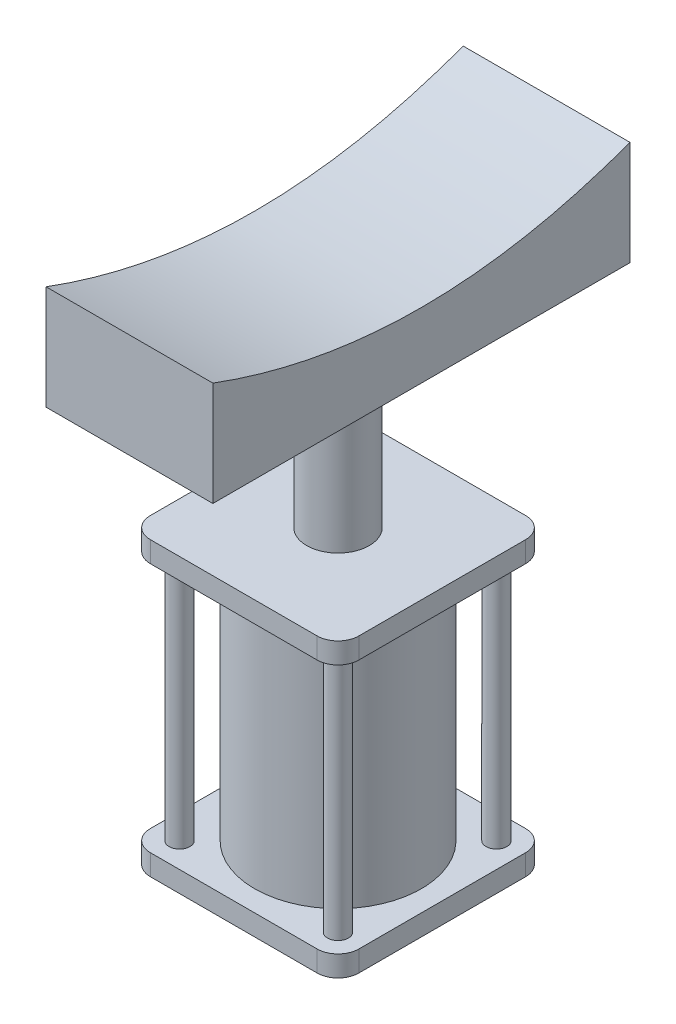
ISO-10303-21;
HEADER;
FILE_DESCRIPTION(('STEP AP214'),'2;1');
FILE_NAME('part.step','',(''),(''),'','','');
FILE_SCHEMA(('AUTOMOTIVE_DESIGN { 1 0 10303 214 1 1 1 1 }'));
ENDSEC;
DATA;
#1=APPLICATION_CONTEXT('core data for automotive mechanical design processes');
#2=APPLICATION_PROTOCOL_DEFINITION('international standard','automotive_design',2000,#1);
#3=PRODUCT_CONTEXT('',#1,'mechanical');
#4=PRODUCT('Part','Part','',(#3));
#5=PRODUCT_RELATED_PRODUCT_CATEGORY('part','',(#4));
#6=PRODUCT_DEFINITION_FORMATION('','',#4);
#7=PRODUCT_DEFINITION_CONTEXT('part definition',#1,'design');
#8=PRODUCT_DEFINITION('design','',#6,#7);
#9=PRODUCT_DEFINITION_SHAPE('','',#8);
#10=(LENGTH_UNIT() NAMED_UNIT(*) SI_UNIT(.MILLI.,.METRE.));
#11=(NAMED_UNIT(*) PLANE_ANGLE_UNIT() SI_UNIT($,.RADIAN.));
#12=(NAMED_UNIT(*) SI_UNIT($,.STERADIAN.) SOLID_ANGLE_UNIT());
#13=UNCERTAINTY_MEASURE_WITH_UNIT(LENGTH_MEASURE(1.E-05),#10,'distance_accuracy_value','');
#14=(GEOMETRIC_REPRESENTATION_CONTEXT(3) GLOBAL_UNCERTAINTY_ASSIGNED_CONTEXT((#13)) GLOBAL_UNIT_ASSIGNED_CONTEXT((#10,
#11,#12)) REPRESENTATION_CONTEXT('',''));
#15=CARTESIAN_POINT('',(0.,0.,0.));
#16=DIRECTION('',(0.,0.,1.));
#17=DIRECTION('',(1.,0.,0.));
#18=AXIS2_PLACEMENT_3D('',#15,#16,#17);
#19=CARTESIAN_POINT('',(-40.,270.,100.));
#20=DIRECTION('',(-1.,0.,0.));
#21=DIRECTION('',(0.,0.,1.));
#22=AXIS2_PLACEMENT_3D('',#19,#20,#21);
#23=PLANE('',#22);
#24=CARTESIAN_POINT('',(-40.,270.,100.));
#25=CARTESIAN_POINT('',(-40.,232.788897751168,0.));
#26=CARTESIAN_POINT('',(-40.,270.,-100.));
#27=B_SPLINE_CURVE_WITH_KNOTS('',2,(#24,#25,#26),.UNSPECIFIED.,.F.,.F.,(3,3),(0.,1.),.UNSPECIFIED.);
#28=CARTESIAN_POINT('',(-40.,270.,-100.));
#29=VERTEX_POINT('',#28);
#30=CARTESIAN_POINT('',(-40.,270.,100.));
#31=VERTEX_POINT('',#30);
#32=EDGE_CURVE('E118',#29,#31,#27,.F.);
#33=ORIENTED_EDGE('',*,*,#32,.F.);
#34=DIRECTION('',(0.,-1.,0.));
#35=VECTOR('',#34,1.);
#36=CARTESIAN_POINT('',(-40.,270.,-100.));
#37=LINE('',#36,#35);
#38=CARTESIAN_POINT('',(-40.,220.,-100.));
#39=VERTEX_POINT('',#38);
#40=EDGE_CURVE('E104',#29,#39,#37,.T.);
#41=ORIENTED_EDGE('',*,*,#40,.T.);
#42=DIRECTION('',(0.,0.,-1.));
#43=VECTOR('',#42,1.);
#44=CARTESIAN_POINT('',(-40.,220.,100.));
#45=LINE('',#44,#43);
#46=CARTESIAN_POINT('',(-40.,220.,100.));
#47=VERTEX_POINT('',#46);
#48=EDGE_CURVE('E99',#47,#39,#45,.T.);
#49=ORIENTED_EDGE('',*,*,#48,.F.);
#50=DIRECTION('',(0.,-1.,0.));
#51=VECTOR('',#50,1.);
#52=CARTESIAN_POINT('',(-40.,270.,100.));
#53=LINE('',#52,#51);
#54=EDGE_CURVE('E12',#31,#47,#53,.T.);
#55=ORIENTED_EDGE('',*,*,#54,.F.);
#56=EDGE_LOOP('',(#33,#41,#49,#55));
#57=FACE_BOUND('',#56,.T.);
#58=ADVANCED_FACE('F43',(#57),#23,.T.);
#59=CARTESIAN_POINT('',(-40.,270.,100.));
#60=DIRECTION('',(0.,0.,-1.));
#61=DIRECTION('',(-1.,0.,0.));
#62=AXIS2_PLACEMENT_3D('',#59,#60,#61);
#63=PLANE('',#62);
#64=DIRECTION('',(1.,0.,0.));
#65=VECTOR('',#64,1.);
#66=CARTESIAN_POINT('',(-40.,220.,100.));
#67=LINE('',#66,#65);
#68=CARTESIAN_POINT('',(40.,220.,100.));
#69=VERTEX_POINT('',#68);
#70=EDGE_CURVE('E76',#47,#69,#67,.T.);
#71=ORIENTED_EDGE('',*,*,#70,.T.);
#72=DIRECTION('',(0.,-1.,0.));
#73=VECTOR('',#72,1.);
#74=CARTESIAN_POINT('',(40.,270.,100.));
#75=LINE('',#74,#73);
#76=CARTESIAN_POINT('',(40.,270.,100.));
#77=VERTEX_POINT('',#76);
#78=EDGE_CURVE('E52',#77,#69,#75,.T.);
#79=ORIENTED_EDGE('',*,*,#78,.F.);
#80=DIRECTION('',(1.,0.,0.));
#81=VECTOR('',#80,1.);
#82=CARTESIAN_POINT('',(-40.,270.,100.));
#83=LINE('',#82,#81);
#84=EDGE_CURVE('E107',#31,#77,#83,.T.);
#85=ORIENTED_EDGE('',*,*,#84,.F.);
#86=ORIENTED_EDGE('',*,*,#54,.T.);
#87=EDGE_LOOP('',(#71,#79,#85,#86));
#88=FACE_BOUND('',#87,.T.);
#89=ADVANCED_FACE('F78',(#88),#63,.F.);
#90=CARTESIAN_POINT('',(40.,270.,100.));
#91=DIRECTION('',(-1.,0.,0.));
#92=DIRECTION('',(0.,0.,1.));
#93=AXIS2_PLACEMENT_3D('',#90,#91,#92);
#94=PLANE('',#93);
#95=DIRECTION('',(0.,-1.,0.));
#96=VECTOR('',#95,1.);
#97=CARTESIAN_POINT('',(40.,270.,-100.));
#98=LINE('',#97,#96);
#99=CARTESIAN_POINT('',(40.,270.,-100.));
#100=VERTEX_POINT('',#99);
#101=CARTESIAN_POINT('',(40.,220.,-100.));
#102=VERTEX_POINT('',#101);
#103=EDGE_CURVE('E93',#100,#102,#98,.T.);
#104=ORIENTED_EDGE('',*,*,#103,.F.);
#105=CARTESIAN_POINT('',(40.,270.,100.));
#106=CARTESIAN_POINT('',(40.,232.788897751168,0.));
#107=CARTESIAN_POINT('',(40.,270.,-100.));
#108=B_SPLINE_CURVE_WITH_KNOTS('',2,(#105,#106,#107),.UNSPECIFIED.,.F.,.F.,(3,3),(0.,1.),.UNSPECIFIED.);
#109=EDGE_CURVE('E60',#77,#100,#108,.T.);
#110=ORIENTED_EDGE('',*,*,#109,.F.);
#111=ORIENTED_EDGE('',*,*,#78,.T.);
#112=DIRECTION('',(0.,0.,-1.));
#113=VECTOR('',#112,1.);
#114=CARTESIAN_POINT('',(40.,220.,100.));
#115=LINE('',#114,#113);
#116=EDGE_CURVE('E87',#69,#102,#115,.T.);
#117=ORIENTED_EDGE('',*,*,#116,.T.);
#118=EDGE_LOOP('',(#104,#110,#111,#117));
#119=FACE_BOUND('',#118,.T.);
#120=ADVANCED_FACE('F91',(#119),#94,.F.);
#121=CARTESIAN_POINT('',(-40.,270.,-100.));
#122=DIRECTION('',(0.,0.,-1.));
#123=DIRECTION('',(-1.,0.,0.));
#124=AXIS2_PLACEMENT_3D('',#121,#122,#123);
#125=PLANE('',#124);
#126=DIRECTION('',(1.,0.,0.));
#127=VECTOR('',#126,1.);
#128=CARTESIAN_POINT('',(-40.,220.,-100.));
#129=LINE('',#128,#127);
#130=EDGE_CURVE('E97',#39,#102,#129,.T.);
#131=ORIENTED_EDGE('',*,*,#130,.F.);
#132=ORIENTED_EDGE('',*,*,#40,.F.);
#133=DIRECTION('',(1.,0.,0.));
#134=VECTOR('',#133,1.);
#135=CARTESIAN_POINT('',(-40.,270.,-100.));
#136=LINE('',#135,#134);
#137=EDGE_CURVE('E86',#29,#100,#136,.T.);
#138=ORIENTED_EDGE('',*,*,#137,.T.);
#139=ORIENTED_EDGE('',*,*,#103,.T.);
#140=EDGE_LOOP('',(#131,#132,#138,#139));
#141=FACE_BOUND('',#140,.T.);
#142=ADVANCED_FACE('F124',(#141),#125,.T.);
#143=CARTESIAN_POINT('',(0.,220.,0.));
#144=DIRECTION('',(0.,-1.,0.));
#145=DIRECTION('',(0.,0.,-1.));
#146=AXIS2_PLACEMENT_3D('',#143,#144,#145);
#147=PLANE('',#146);
#148=ORIENTED_EDGE('',*,*,#48,.T.);
#149=ORIENTED_EDGE('',*,*,#130,.T.);
#150=ORIENTED_EDGE('',*,*,#116,.F.);
#151=ORIENTED_EDGE('',*,*,#70,.F.);
#152=EDGE_LOOP('',(#148,#149,#150,#151));
#153=FACE_BOUND('',#152,.T.);
#154=ADVANCED_FACE('F95',(#153),#147,.T.);
#155=CARTESIAN_POINT('',(-1460.,270.,100.));
#156=CARTESIAN_POINT('',(-1460.,232.788897751168,0.));
#157=CARTESIAN_POINT('',(-1460.,270.,-100.));
#158=B_SPLINE_CURVE_WITH_KNOTS('',2,(#155,#156,#157),.UNSPECIFIED.,.F.,.F.,(3,3),(0.,1.),.UNSPECIFIED.);
#159=DIRECTION('',(1.,0.,0.));
#160=VECTOR('',#159,1.);
#161=SURFACE_OF_LINEAR_EXTRUSION('',#158,#160);
#162=ORIENTED_EDGE('',*,*,#32,.T.);
#163=ORIENTED_EDGE('',*,*,#84,.T.);
#164=ORIENTED_EDGE('',*,*,#109,.T.);
#165=ORIENTED_EDGE('',*,*,#137,.F.);
#166=EDGE_LOOP('',(#162,#163,#164,#165));
#167=FACE_BOUND('',#166,.T.);
#168=ADVANCED_FACE('F115',(#167),#161,.F.);
#169=CLOSED_SHELL('',(#58,#89,#120,#142,#154,#168));
#170=MANIFOLD_SOLID_BREP('B2',#169);
#171=CARTESIAN_POINT('',(0.,220.,0.));
#172=DIRECTION('',(0.,-1.,0.));
#173=DIRECTION('',(0.,0.,-1.));
#174=AXIS2_PLACEMENT_3D('',#171,#172,#173);
#175=CYLINDRICAL_SURFACE('',#174,15.);
#176=CARTESIAN_POINT('',(0.,220.,0.));
#177=DIRECTION('',(0.,1.,0.));
#178=DIRECTION('',(0.,0.,1.));
#179=AXIS2_PLACEMENT_3D('',#176,#177,#178);
#180=CIRCLE('',#179,15.);
#181=CARTESIAN_POINT('',(0.,220.,15.));
#182=VERTEX_POINT('',#181);
#183=EDGE_CURVE('E42',#182,#182,#180,.T.);
#184=ORIENTED_EDGE('',*,*,#183,.F.);
#185=EDGE_LOOP('',(#184));
#186=FACE_BOUND('',#185,.T.);
#187=CARTESIAN_POINT('',(0.,140.,0.));
#188=DIRECTION('',(0.,1.,0.));
#189=DIRECTION('',(0.,0.,1.));
#190=AXIS2_PLACEMENT_3D('',#187,#188,#189);
#191=CIRCLE('',#190,15.);
#192=CARTESIAN_POINT('',(0.,140.,15.));
#193=VERTEX_POINT('',#192);
#194=EDGE_CURVE('E205',#193,#193,#191,.T.);
#195=ORIENTED_EDGE('',*,*,#194,.T.);
#196=EDGE_LOOP('',(#195));
#197=FACE_BOUND('',#196,.T.);
#198=ADVANCED_FACE('F202',(#186,#197),#175,.T.);
#199=CARTESIAN_POINT('',(0.,220.,0.));
#200=DIRECTION('',(0.,1.,0.));
#201=DIRECTION('',(0.,0.,1.));
#202=AXIS2_PLACEMENT_3D('',#199,#200,#201);
#203=PLANE('',#202);
#204=ORIENTED_EDGE('',*,*,#183,.T.);
#205=EDGE_LOOP('',(#204));
#206=FACE_BOUND('',#205,.T.);
#207=ADVANCED_FACE('F217',(#206),#203,.T.);
#208=CARTESIAN_POINT('',(0.,140.,0.));
#209=DIRECTION('',(0.,1.,0.));
#210=DIRECTION('',(0.,0.,1.));
#211=AXIS2_PLACEMENT_3D('',#208,#209,#210);
#212=PLANE('',#211);
#213=ORIENTED_EDGE('',*,*,#194,.F.);
#214=EDGE_LOOP('',(#213));
#215=FACE_BOUND('',#214,.T.);
#216=ADVANCED_FACE('F215',(#215),#212,.F.);
#217=CLOSED_SHELL('',(#198,#207,#216));
#218=MANIFOLD_SOLID_BREP('B6',#217);
#219=CARTESIAN_POINT('',(50.,10.,50.));
#220=DIRECTION('',(-1.,0.,0.));
#221=DIRECTION('',(0.,0.,1.));
#222=AXIS2_PLACEMENT_3D('',#219,#220,#221);
#223=PLANE('',#222);
#224=DIRECTION('',(0.,0.,-1.));
#225=VECTOR('',#224,1.);
#226=CARTESIAN_POINT('',(50.,0.,50.));
#227=LINE('',#226,#225);
#228=CARTESIAN_POINT('',(50.,0.,40.));
#229=VERTEX_POINT('',#228);
#230=CARTESIAN_POINT('',(50.,0.,-40.));
#231=VERTEX_POINT('',#230);
#232=EDGE_CURVE('E383',#229,#231,#227,.T.);
#233=ORIENTED_EDGE('',*,*,#232,.T.);
#234=DIRECTION('',(0.,-1.,0.));
#235=VECTOR('',#234,1.);
#236=CARTESIAN_POINT('',(50.,10.,-40.));
#237=LINE('',#236,#235);
#238=CARTESIAN_POINT('',(50.,10.,-40.));
#239=VERTEX_POINT('',#238);
#240=EDGE_CURVE('E361',#231,#239,#237,.F.);
#241=ORIENTED_EDGE('',*,*,#240,.T.);
#242=DIRECTION('',(0.,0.,-1.));
#243=VECTOR('',#242,1.);
#244=CARTESIAN_POINT('',(50.,10.,50.));
#245=LINE('',#244,#243);
#246=CARTESIAN_POINT('',(50.,10.,40.));
#247=VERTEX_POINT('',#246);
#248=EDGE_CURVE('E394',#247,#239,#245,.T.);
#249=ORIENTED_EDGE('',*,*,#248,.F.);
#250=DIRECTION('',(0.,-1.,0.));
#251=VECTOR('',#250,1.);
#252=CARTESIAN_POINT('',(50.,10.,40.));
#253=LINE('',#252,#251);
#254=EDGE_CURVE('E366',#247,#229,#253,.T.);
#255=ORIENTED_EDGE('',*,*,#254,.T.);
#256=EDGE_LOOP('',(#233,#241,#249,#255));
#257=FACE_BOUND('',#256,.T.);
#258=ADVANCED_FACE('F242',(#257),#223,.F.);
#259=CARTESIAN_POINT('',(-50.,10.,-50.));
#260=DIRECTION('',(0.,0.,1.));
#261=DIRECTION('',(1.,0.,0.));
#262=AXIS2_PLACEMENT_3D('',#259,#260,#261);
#263=PLANE('',#262);
#264=DIRECTION('',(-1.,0.,0.));
#265=VECTOR('',#264,1.);
#266=CARTESIAN_POINT('',(-50.,10.,-50.));
#267=LINE('',#266,#265);
#268=CARTESIAN_POINT('',(40.,10.,-50.));
#269=VERTEX_POINT('',#268);
#270=CARTESIAN_POINT('',(-40.,10.,-50.));
#271=VERTEX_POINT('',#270);
#272=EDGE_CURVE('E376',#269,#271,#267,.T.);
#273=ORIENTED_EDGE('',*,*,#272,.F.);
#274=DIRECTION('',(0.,-1.,0.));
#275=VECTOR('',#274,1.);
#276=CARTESIAN_POINT('',(40.,10.,-50.));
#277=LINE('',#276,#275);
#278=CARTESIAN_POINT('',(40.,0.,-50.));
#279=VERTEX_POINT('',#278);
#280=EDGE_CURVE('E360',#269,#279,#277,.T.);
#281=ORIENTED_EDGE('',*,*,#280,.T.);
#282=DIRECTION('',(-1.,0.,0.));
#283=VECTOR('',#282,1.);
#284=CARTESIAN_POINT('',(-50.,0.,-50.));
#285=LINE('',#284,#283);
#286=CARTESIAN_POINT('',(-40.,0.,-50.));
#287=VERTEX_POINT('',#286);
#288=EDGE_CURVE('E373',#279,#287,#285,.T.);
#289=ORIENTED_EDGE('',*,*,#288,.T.);
#290=DIRECTION('',(0.,-1.,0.));
#291=VECTOR('',#290,1.);
#292=CARTESIAN_POINT('',(-40.,10.,-50.));
#293=LINE('',#292,#291);
#294=EDGE_CURVE('E378',#287,#271,#293,.F.);
#295=ORIENTED_EDGE('',*,*,#294,.T.);
#296=EDGE_LOOP('',(#273,#281,#289,#295));
#297=FACE_BOUND('',#296,.T.);
#298=ADVANCED_FACE('F372',(#297),#263,.F.);
#299=CARTESIAN_POINT('',(-50.,10.,50.));
#300=DIRECTION('',(1.,0.,0.));
#301=DIRECTION('',(0.,0.,-1.));
#302=AXIS2_PLACEMENT_3D('',#299,#300,#301);
#303=PLANE('',#302);
#304=DIRECTION('',(0.,0.,1.));
#305=VECTOR('',#304,1.);
#306=CARTESIAN_POINT('',(-50.,0.,50.));
#307=LINE('',#306,#305);
#308=CARTESIAN_POINT('',(-50.,0.,-40.));
#309=VERTEX_POINT('',#308);
#310=CARTESIAN_POINT('',(-50.,0.,40.));
#311=VERTEX_POINT('',#310);
#312=EDGE_CURVE('E382',#309,#311,#307,.T.);
#313=ORIENTED_EDGE('',*,*,#312,.T.);
#314=DIRECTION('',(0.,-1.,0.));
#315=VECTOR('',#314,1.);
#316=CARTESIAN_POINT('',(-50.,10.,40.));
#317=LINE('',#316,#315);
#318=CARTESIAN_POINT('',(-50.,10.,40.));
#319=VERTEX_POINT('',#318);
#320=EDGE_CURVE('E444',#311,#319,#317,.F.);
#321=ORIENTED_EDGE('',*,*,#320,.T.);
#322=DIRECTION('',(0.,0.,1.));
#323=VECTOR('',#322,1.);
#324=CARTESIAN_POINT('',(-50.,10.,50.));
#325=LINE('',#324,#323);
#326=CARTESIAN_POINT('',(-50.,10.,-40.));
#327=VERTEX_POINT('',#326);
#328=EDGE_CURVE('E511',#327,#319,#325,.T.);
#329=ORIENTED_EDGE('',*,*,#328,.F.);
#330=DIRECTION('',(0.,-1.,0.));
#331=VECTOR('',#330,1.);
#332=CARTESIAN_POINT('',(-50.,10.,-40.));
#333=LINE('',#332,#331);
#334=EDGE_CURVE('E441',#327,#309,#333,.T.);
#335=ORIENTED_EDGE('',*,*,#334,.T.);
#336=EDGE_LOOP('',(#313,#321,#329,#335));
#337=FACE_BOUND('',#336,.T.);
#338=ADVANCED_FACE('F533',(#337),#303,.F.);
#339=CARTESIAN_POINT('',(-50.,10.,50.));
#340=DIRECTION('',(0.,0.,-1.));
#341=DIRECTION('',(-1.,0.,0.));
#342=AXIS2_PLACEMENT_3D('',#339,#340,#341);
#343=PLANE('',#342);
#344=DIRECTION('',(1.,0.,0.));
#345=VECTOR('',#344,1.);
#346=CARTESIAN_POINT('',(-50.,0.,50.));
#347=LINE('',#346,#345);
#348=CARTESIAN_POINT('',(-40.,0.,50.));
#349=VERTEX_POINT('',#348);
#350=CARTESIAN_POINT('',(40.,0.,50.));
#351=VERTEX_POINT('',#350);
#352=EDGE_CURVE('E386',#349,#351,#347,.T.);
#353=ORIENTED_EDGE('',*,*,#352,.T.);
#354=DIRECTION('',(0.,-1.,0.));
#355=VECTOR('',#354,1.);
#356=CARTESIAN_POINT('',(40.,10.,50.));
#357=LINE('',#356,#355);
#358=CARTESIAN_POINT('',(40.,10.,50.));
#359=VERTEX_POINT('',#358);
#360=EDGE_CURVE('E439',#351,#359,#357,.F.);
#361=ORIENTED_EDGE('',*,*,#360,.T.);
#362=DIRECTION('',(1.,0.,0.));
#363=VECTOR('',#362,1.);
#364=CARTESIAN_POINT('',(-50.,10.,50.));
#365=LINE('',#364,#363);
#366=CARTESIAN_POINT('',(-40.,10.,50.));
#367=VERTEX_POINT('',#366);
#368=EDGE_CURVE('E399',#367,#359,#365,.T.);
#369=ORIENTED_EDGE('',*,*,#368,.F.);
#370=DIRECTION('',(0.,-1.,0.));
#371=VECTOR('',#370,1.);
#372=CARTESIAN_POINT('',(-40.,10.,50.));
#373=LINE('',#372,#371);
#374=EDGE_CURVE('E436',#367,#349,#373,.T.);
#375=ORIENTED_EDGE('',*,*,#374,.T.);
#376=EDGE_LOOP('',(#353,#361,#369,#375));
#377=FACE_BOUND('',#376,.T.);
#378=ADVANCED_FACE('F528',(#377),#343,.F.);
#379=CARTESIAN_POINT('',(0.,10.,0.));
#380=DIRECTION('',(0.,-1.,0.));
#381=DIRECTION('',(0.,0.,-1.));
#382=AXIS2_PLACEMENT_3D('',#379,#380,#381);
#383=PLANE('',#382);
#384=CARTESIAN_POINT('',(-38.,10.,38.));
#385=DIRECTION('',(0.,-1.,0.));
#386=DIRECTION('',(0.,0.,-1.));
#387=AXIS2_PLACEMENT_3D('',#384,#385,#386);
#388=CIRCLE('',#387,5.);
#389=CARTESIAN_POINT('',(-38.,10.,33.));
#390=VERTEX_POINT('',#389);
#391=EDGE_CURVE('E417',#390,#390,#388,.F.);
#392=ORIENTED_EDGE('',*,*,#391,.F.);
#393=EDGE_LOOP('',(#392));
#394=FACE_BOUND('',#393,.T.);
#395=CARTESIAN_POINT('',(38.,10.,38.));
#396=DIRECTION('',(0.,-1.,0.));
#397=DIRECTION('',(0.,0.,-1.));
#398=AXIS2_PLACEMENT_3D('',#395,#396,#397);
#399=CIRCLE('',#398,5.);
#400=CARTESIAN_POINT('',(38.,10.,33.));
#401=VERTEX_POINT('',#400);
#402=EDGE_CURVE('E411',#401,#401,#399,.F.);
#403=ORIENTED_EDGE('',*,*,#402,.F.);
#404=EDGE_LOOP('',(#403));
#405=FACE_BOUND('',#404,.T.);
#406=CARTESIAN_POINT('',(38.,10.,-38.));
#407=DIRECTION('',(0.,-1.,0.));
#408=DIRECTION('',(0.,0.,-1.));
#409=AXIS2_PLACEMENT_3D('',#406,#407,#408);
#410=CIRCLE('',#409,5.);
#411=CARTESIAN_POINT('',(38.,10.,-43.));
#412=VERTEX_POINT('',#411);
#413=EDGE_CURVE('E405',#412,#412,#410,.F.);
#414=ORIENTED_EDGE('',*,*,#413,.F.);
#415=EDGE_LOOP('',(#414));
#416=FACE_BOUND('',#415,.T.);
#417=CARTESIAN_POINT('',(0.,9.99999999999999,0.));
#418=DIRECTION('',(0.,-1.,0.));
#419=DIRECTION('',(0.,0.,-1.));
#420=AXIS2_PLACEMENT_3D('',#417,#418,#419);
#421=CIRCLE('',#420,40.);
#422=CARTESIAN_POINT('',(0.,9.99999999999999,-40.));
#423=VERTEX_POINT('',#422);
#424=EDGE_CURVE('E398',#423,#423,#421,.F.);
#425=ORIENTED_EDGE('',*,*,#424,.F.);
#426=EDGE_LOOP('',(#425));
#427=FACE_BOUND('',#426,.T.);
#428=CARTESIAN_POINT('',(-38.,10.,-38.));
#429=DIRECTION('',(0.,-1.,0.));
#430=DIRECTION('',(0.,0.,-1.));
#431=AXIS2_PLACEMENT_3D('',#428,#429,#430);
#432=CIRCLE('',#431,5.);
#433=CARTESIAN_POINT('',(-38.,10.,-43.));
#434=VERTEX_POINT('',#433);
#435=EDGE_CURVE('E395',#434,#434,#432,.F.);
#436=ORIENTED_EDGE('',*,*,#435,.F.);
#437=EDGE_LOOP('',(#436));
#438=FACE_BOUND('',#437,.T.);
#439=ORIENTED_EDGE('',*,*,#248,.T.);
#440=CARTESIAN_POINT('',(40.,10.,-40.));
#441=DIRECTION('',(0.,-1.,0.));
#442=DIRECTION('',(0.,0.,-1.));
#443=AXIS2_PLACEMENT_3D('',#440,#441,#442);
#444=CIRCLE('',#443,10.);
#445=EDGE_CURVE('E434',#239,#269,#444,.F.);
#446=ORIENTED_EDGE('',*,*,#445,.T.);
#447=ORIENTED_EDGE('',*,*,#272,.T.);
#448=CARTESIAN_POINT('',(-40.,10.,-40.));
#449=DIRECTION('',(0.,-1.,0.));
#450=DIRECTION('',(0.,0.,-1.));
#451=AXIS2_PLACEMENT_3D('',#448,#449,#450);
#452=CIRCLE('',#451,10.);
#453=EDGE_CURVE('E428',#271,#327,#452,.F.);
#454=ORIENTED_EDGE('',*,*,#453,.T.);
#455=ORIENTED_EDGE('',*,*,#328,.T.);
#456=CARTESIAN_POINT('',(-40.,10.,40.));
#457=DIRECTION('',(0.,-1.,0.));
#458=DIRECTION('',(0.,0.,-1.));
#459=AXIS2_PLACEMENT_3D('',#456,#457,#458);
#460=CIRCLE('',#459,10.);
#461=EDGE_CURVE('E430',#319,#367,#460,.F.);
#462=ORIENTED_EDGE('',*,*,#461,.T.);
#463=ORIENTED_EDGE('',*,*,#368,.T.);
#464=CARTESIAN_POINT('',(40.,10.,40.));
#465=DIRECTION('',(0.,-1.,0.));
#466=DIRECTION('',(0.,0.,-1.));
#467=AXIS2_PLACEMENT_3D('',#464,#465,#466);
#468=CIRCLE('',#467,10.);
#469=EDGE_CURVE('E432',#359,#247,#468,.F.);
#470=ORIENTED_EDGE('',*,*,#469,.T.);
#471=EDGE_LOOP('',(#439,#446,#447,#454,#455,#462,#463,#470));
#472=FACE_BOUND('',#471,.T.);
#473=ADVANCED_FACE('F517',(#394,#405,#416,#427,#438,#472),#383,.F.);
#474=CARTESIAN_POINT('',(0.,0.,0.));
#475=DIRECTION('',(0.,-1.,0.));
#476=DIRECTION('',(0.,0.,-1.));
#477=AXIS2_PLACEMENT_3D('',#474,#475,#476);
#478=PLANE('',#477);
#479=ORIENTED_EDGE('',*,*,#288,.F.);
#480=CARTESIAN_POINT('',(40.,0.,-40.));
#481=DIRECTION('',(0.,-1.,0.));
#482=DIRECTION('',(0.,0.,-1.));
#483=AXIS2_PLACEMENT_3D('',#480,#481,#482);
#484=CIRCLE('',#483,10.);
#485=EDGE_CURVE('E356',#279,#231,#484,.T.);
#486=ORIENTED_EDGE('',*,*,#485,.T.);
#487=ORIENTED_EDGE('',*,*,#232,.F.);
#488=CARTESIAN_POINT('',(40.,0.,40.));
#489=DIRECTION('',(0.,-1.,0.));
#490=DIRECTION('',(0.,0.,-1.));
#491=AXIS2_PLACEMENT_3D('',#488,#489,#490);
#492=CIRCLE('',#491,10.);
#493=EDGE_CURVE('E367',#229,#351,#492,.T.);
#494=ORIENTED_EDGE('',*,*,#493,.T.);
#495=ORIENTED_EDGE('',*,*,#352,.F.);
#496=CARTESIAN_POINT('',(-40.,0.,40.));
#497=DIRECTION('',(0.,-1.,0.));
#498=DIRECTION('',(0.,0.,-1.));
#499=AXIS2_PLACEMENT_3D('',#496,#497,#498);
#500=CIRCLE('',#499,10.);
#501=EDGE_CURVE('E422',#349,#311,#500,.T.);
#502=ORIENTED_EDGE('',*,*,#501,.T.);
#503=ORIENTED_EDGE('',*,*,#312,.F.);
#504=CARTESIAN_POINT('',(-40.,0.,-40.));
#505=DIRECTION('',(0.,-1.,0.));
#506=DIRECTION('',(0.,0.,-1.));
#507=AXIS2_PLACEMENT_3D('',#504,#505,#506);
#508=CIRCLE('',#507,10.);
#509=EDGE_CURVE('E377',#309,#287,#508,.T.);
#510=ORIENTED_EDGE('',*,*,#509,.T.);
#511=EDGE_LOOP('',(#479,#486,#487,#494,#495,#502,#503,#510));
#512=FACE_BOUND('',#511,.T.);
#513=ADVANCED_FACE('F380',(#512),#478,.T.);
#514=CARTESIAN_POINT('',(-38.,144.142135623731,-38.));
#515=DIRECTION('',(0.,-1.,0.));
#516=DIRECTION('',(0.,0.,-1.));
#517=AXIS2_PLACEMENT_3D('',#514,#515,#516);
#518=CYLINDRICAL_SURFACE('',#517,5.);
#519=ORIENTED_EDGE('',*,*,#435,.T.);
#520=EDGE_LOOP('',(#519));
#521=FACE_BOUND('',#520,.T.);
#522=CARTESIAN_POINT('',(-38.,130.,-38.));
#523=DIRECTION('',(0.,1.,0.));
#524=DIRECTION('',(0.,0.,1.));
#525=AXIS2_PLACEMENT_3D('',#522,#523,#524);
#526=CIRCLE('',#525,5.);
#527=CARTESIAN_POINT('',(-38.,130.,-33.));
#528=VERTEX_POINT('',#527);
#529=EDGE_CURVE('E388',#528,#528,#526,.T.);
#530=ORIENTED_EDGE('',*,*,#529,.F.);
#531=EDGE_LOOP('',(#530));
#532=FACE_BOUND('',#531,.T.);
#533=ADVANCED_FACE('F647',(#521,#532),#518,.T.);
#534=CARTESIAN_POINT('',(0.,130.,0.));
#535=DIRECTION('',(0.,-1.,0.));
#536=DIRECTION('',(0.,0.,-1.));
#537=AXIS2_PLACEMENT_3D('',#534,#535,#536);
#538=CYLINDRICAL_SURFACE('',#537,40.);
#539=CARTESIAN_POINT('',(0.,130.,0.));
#540=DIRECTION('',(0.,1.,0.));
#541=DIRECTION('',(0.,0.,1.));
#542=AXIS2_PLACEMENT_3D('',#539,#540,#541);
#543=CIRCLE('',#542,40.);
#544=CARTESIAN_POINT('',(0.,130.,40.));
#545=VERTEX_POINT('',#544);
#546=EDGE_CURVE('E502',#545,#545,#543,.T.);
#547=ORIENTED_EDGE('',*,*,#546,.F.);
#548=EDGE_LOOP('',(#547));
#549=FACE_BOUND('',#548,.T.);
#550=ORIENTED_EDGE('',*,*,#424,.T.);
#551=EDGE_LOOP('',(#550));
#552=FACE_BOUND('',#551,.T.);
#553=ADVANCED_FACE('F644',(#549,#552),#538,.T.);
#554=CARTESIAN_POINT('',(-50.,140.,-50.));
#555=DIRECTION('',(1.,0.,0.));
#556=DIRECTION('',(0.,0.,-1.));
#557=AXIS2_PLACEMENT_3D('',#554,#555,#556);
#558=PLANE('',#557);
#559=DIRECTION('',(0.,0.,1.));
#560=VECTOR('',#559,1.);
#561=CARTESIAN_POINT('',(-50.,140.,-50.));
#562=LINE('',#561,#560);
#563=CARTESIAN_POINT('',(-50.,140.,-40.));
#564=VERTEX_POINT('',#563);
#565=CARTESIAN_POINT('',(-50.,140.,40.));
#566=VERTEX_POINT('',#565);
#567=EDGE_CURVE('E501',#564,#566,#562,.T.);
#568=ORIENTED_EDGE('',*,*,#567,.F.);
#569=DIRECTION('',(0.,-1.,0.));
#570=VECTOR('',#569,1.);
#571=CARTESIAN_POINT('',(-50.,140.,-40.));
#572=LINE('',#571,#570);
#573=CARTESIAN_POINT('',(-50.,130.,-40.));
#574=VERTEX_POINT('',#573);
#575=EDGE_CURVE('E448',#564,#574,#572,.T.);
#576=ORIENTED_EDGE('',*,*,#575,.T.);
#577=DIRECTION('',(0.,0.,1.));
#578=VECTOR('',#577,1.);
#579=CARTESIAN_POINT('',(-50.,130.,-50.));
#580=LINE('',#579,#578);
#581=CARTESIAN_POINT('',(-50.,130.,40.));
#582=VERTEX_POINT('',#581);
#583=EDGE_CURVE('E492',#574,#582,#580,.T.);
#584=ORIENTED_EDGE('',*,*,#583,.T.);
#585=DIRECTION('',(0.,-1.,0.));
#586=VECTOR('',#585,1.);
#587=CARTESIAN_POINT('',(-50.,140.,40.));
#588=LINE('',#587,#586);
#589=EDGE_CURVE('E446',#582,#566,#588,.F.);
#590=ORIENTED_EDGE('',*,*,#589,.T.);
#591=EDGE_LOOP('',(#568,#576,#584,#590));
#592=FACE_BOUND('',#591,.T.);
#593=ADVANCED_FACE('F627',(#592),#558,.F.);
#594=CARTESIAN_POINT('',(-50.,140.,50.));
#595=DIRECTION('',(0.,0.,-1.));
#596=DIRECTION('',(-1.,0.,0.));
#597=AXIS2_PLACEMENT_3D('',#594,#595,#596);
#598=PLANE('',#597);
#599=DIRECTION('',(1.,0.,0.));
#600=VECTOR('',#599,1.);
#601=CARTESIAN_POINT('',(-50.,130.,50.));
#602=LINE('',#601,#600);
#603=CARTESIAN_POINT('',(-40.,130.,50.));
#604=VERTEX_POINT('',#603);
#605=CARTESIAN_POINT('',(40.,130.,50.));
#606=VERTEX_POINT('',#605);
#607=EDGE_CURVE('E481',#604,#606,#602,.T.);
#608=ORIENTED_EDGE('',*,*,#607,.T.);
#609=DIRECTION('',(0.,-1.,0.));
#610=VECTOR('',#609,1.);
#611=CARTESIAN_POINT('',(40.,140.,50.));
#612=LINE('',#611,#610);
#613=CARTESIAN_POINT('',(40.,140.,50.));
#614=VERTEX_POINT('',#613);
#615=EDGE_CURVE('E200',#606,#614,#612,.F.);
#616=ORIENTED_EDGE('',*,*,#615,.T.);
#617=DIRECTION('',(1.,0.,0.));
#618=VECTOR('',#617,1.);
#619=CARTESIAN_POINT('',(-50.,140.,50.));
#620=LINE('',#619,#618);
#621=CARTESIAN_POINT('',(-40.,140.,50.));
#622=VERTEX_POINT('',#621);
#623=EDGE_CURVE('E483',#622,#614,#620,.T.);
#624=ORIENTED_EDGE('',*,*,#623,.F.);
#625=DIRECTION('',(0.,-1.,0.));
#626=VECTOR('',#625,1.);
#627=CARTESIAN_POINT('',(-40.,140.,50.));
#628=LINE('',#627,#626);
#629=EDGE_CURVE('E250',#622,#604,#628,.T.);
#630=ORIENTED_EDGE('',*,*,#629,.T.);
#631=EDGE_LOOP('',(#608,#616,#624,#630));
#632=FACE_BOUND('',#631,.T.);
#633=ADVANCED_FACE('F480',(#632),#598,.F.);
#634=CARTESIAN_POINT('',(50.,140.,-50.));
#635=DIRECTION('',(-1.,0.,0.));
#636=DIRECTION('',(0.,0.,1.));
#637=AXIS2_PLACEMENT_3D('',#634,#635,#636);
#638=PLANE('',#637);
#639=DIRECTION('',(0.,0.,-1.));
#640=VECTOR('',#639,1.);
#641=CARTESIAN_POINT('',(50.,130.,-50.));
#642=LINE('',#641,#640);
#643=CARTESIAN_POINT('',(50.,130.,40.));
#644=VERTEX_POINT('',#643);
#645=CARTESIAN_POINT('',(50.,130.,-40.));
#646=VERTEX_POINT('',#645);
#647=EDGE_CURVE('E491',#644,#646,#642,.T.);
#648=ORIENTED_EDGE('',*,*,#647,.T.);
#649=DIRECTION('',(0.,-1.,0.));
#650=VECTOR('',#649,1.);
#651=CARTESIAN_POINT('',(50.,140.,-40.));
#652=LINE('',#651,#650);
#653=CARTESIAN_POINT('',(50.,140.,-40.));
#654=VERTEX_POINT('',#653);
#655=EDGE_CURVE('E257',#646,#654,#652,.F.);
#656=ORIENTED_EDGE('',*,*,#655,.T.);
#657=DIRECTION('',(0.,0.,-1.));
#658=VECTOR('',#657,1.);
#659=CARTESIAN_POINT('',(50.,140.,-50.));
#660=LINE('',#659,#658);
#661=CARTESIAN_POINT('',(50.,140.,40.));
#662=VERTEX_POINT('',#661);
#663=EDGE_CURVE('E619',#662,#654,#660,.T.);
#664=ORIENTED_EDGE('',*,*,#663,.F.);
#665=DIRECTION('',(0.,-1.,0.));
#666=VECTOR('',#665,1.);
#667=CARTESIAN_POINT('',(50.,140.,40.));
#668=LINE('',#667,#666);
#669=EDGE_CURVE('E471',#662,#644,#668,.T.);
#670=ORIENTED_EDGE('',*,*,#669,.T.);
#671=EDGE_LOOP('',(#648,#656,#664,#670));
#672=FACE_BOUND('',#671,.T.);
#673=ADVANCED_FACE('F630',(#672),#638,.F.);
#674=CARTESIAN_POINT('',(-50.,140.,-50.));
#675=DIRECTION('',(0.,0.,1.));
#676=DIRECTION('',(1.,0.,0.));
#677=AXIS2_PLACEMENT_3D('',#674,#675,#676);
#678=PLANE('',#677);
#679=DIRECTION('',(-1.,0.,0.));
#680=VECTOR('',#679,1.);
#681=CARTESIAN_POINT('',(-50.,130.,-50.));
#682=LINE('',#681,#680);
#683=CARTESIAN_POINT('',(40.,130.,-50.));
#684=VERTEX_POINT('',#683);
#685=CARTESIAN_POINT('',(-40.,130.,-50.));
#686=VERTEX_POINT('',#685);
#687=EDGE_CURVE('E494',#684,#686,#682,.T.);
#688=ORIENTED_EDGE('',*,*,#687,.T.);
#689=DIRECTION('',(0.,-1.,0.));
#690=VECTOR('',#689,1.);
#691=CARTESIAN_POINT('',(-40.,140.,-50.));
#692=LINE('',#691,#690);
#693=CARTESIAN_POINT('',(-40.,140.,-50.));
#694=VERTEX_POINT('',#693);
#695=EDGE_CURVE('E462',#686,#694,#692,.F.);
#696=ORIENTED_EDGE('',*,*,#695,.T.);
#697=DIRECTION('',(-1.,0.,0.));
#698=VECTOR('',#697,1.);
#699=CARTESIAN_POINT('',(-50.,140.,-50.));
#700=LINE('',#699,#698);
#701=CARTESIAN_POINT('',(40.,140.,-50.));
#702=VERTEX_POINT('',#701);
#703=EDGE_CURVE('E505',#702,#694,#700,.T.);
#704=ORIENTED_EDGE('',*,*,#703,.F.);
#705=DIRECTION('',(0.,-1.,0.));
#706=VECTOR('',#705,1.);
#707=CARTESIAN_POINT('',(40.,140.,-50.));
#708=LINE('',#707,#706);
#709=EDGE_CURVE('E459',#702,#684,#708,.T.);
#710=ORIENTED_EDGE('',*,*,#709,.T.);
#711=EDGE_LOOP('',(#688,#696,#704,#710));
#712=FACE_BOUND('',#711,.T.);
#713=ADVANCED_FACE('F629',(#712),#678,.F.);
#714=CARTESIAN_POINT('',(0.,140.,0.));
#715=DIRECTION('',(0.,1.,0.));
#716=DIRECTION('',(0.,0.,1.));
#717=AXIS2_PLACEMENT_3D('',#714,#715,#716);
#718=PLANE('',#717);
#719=ORIENTED_EDGE('',*,*,#703,.T.);
#720=CARTESIAN_POINT('',(-40.,140.,-40.));
#721=DIRECTION('',(0.,1.,0.));
#722=DIRECTION('',(0.,0.,1.));
#723=AXIS2_PLACEMENT_3D('',#720,#721,#722);
#724=CIRCLE('',#723,10.);
#725=EDGE_CURVE('E469',#694,#564,#724,.T.);
#726=ORIENTED_EDGE('',*,*,#725,.T.);
#727=ORIENTED_EDGE('',*,*,#567,.T.);
#728=CARTESIAN_POINT('',(-40.,140.,40.));
#729=DIRECTION('',(0.,1.,0.));
#730=DIRECTION('',(0.,0.,1.));
#731=AXIS2_PLACEMENT_3D('',#728,#729,#730);
#732=CIRCLE('',#731,10.);
#733=EDGE_CURVE('E464',#566,#622,#732,.T.);
#734=ORIENTED_EDGE('',*,*,#733,.T.);
#735=ORIENTED_EDGE('',*,*,#623,.T.);
#736=CARTESIAN_POINT('',(40.,140.,40.));
#737=DIRECTION('',(0.,1.,0.));
#738=DIRECTION('',(0.,0.,1.));
#739=AXIS2_PLACEMENT_3D('',#736,#737,#738);
#740=CIRCLE('',#739,10.);
#741=EDGE_CURVE('E264',#614,#662,#740,.T.);
#742=ORIENTED_EDGE('',*,*,#741,.T.);
#743=ORIENTED_EDGE('',*,*,#663,.T.);
#744=CARTESIAN_POINT('',(40.,140.,-40.));
#745=DIRECTION('',(0.,1.,0.));
#746=DIRECTION('',(0.,0.,1.));
#747=AXIS2_PLACEMENT_3D('',#744,#745,#746);
#748=CIRCLE('',#747,10.);
#749=EDGE_CURVE('E467',#654,#702,#748,.T.);
#750=ORIENTED_EDGE('',*,*,#749,.T.);
#751=EDGE_LOOP('',(#719,#726,#727,#734,#735,#742,#743,#750));
#752=FACE_BOUND('',#751,.T.);
#753=ADVANCED_FACE('F613',(#752),#718,.T.);
#754=CARTESIAN_POINT('',(0.,130.,0.));
#755=DIRECTION('',(0.,1.,0.));
#756=DIRECTION('',(0.,0.,1.));
#757=AXIS2_PLACEMENT_3D('',#754,#755,#756);
#758=PLANE('',#757);
#759=CARTESIAN_POINT('',(-38.,130.,38.));
#760=DIRECTION('',(0.,1.,0.));
#761=DIRECTION('',(0.,0.,1.));
#762=AXIS2_PLACEMENT_3D('',#759,#760,#761);
#763=CIRCLE('',#762,5.);
#764=CARTESIAN_POINT('',(-38.,130.,43.));
#765=VERTEX_POINT('',#764);
#766=EDGE_CURVE('E414',#765,#765,#763,.F.);
#767=ORIENTED_EDGE('',*,*,#766,.F.);
#768=EDGE_LOOP('',(#767));
#769=FACE_BOUND('',#768,.T.);
#770=CARTESIAN_POINT('',(38.,130.,38.));
#771=DIRECTION('',(0.,1.,0.));
#772=DIRECTION('',(0.,0.,1.));
#773=AXIS2_PLACEMENT_3D('',#770,#771,#772);
#774=CIRCLE('',#773,5.);
#775=CARTESIAN_POINT('',(38.,130.,43.));
#776=VERTEX_POINT('',#775);
#777=EDGE_CURVE('E408',#776,#776,#774,.F.);
#778=ORIENTED_EDGE('',*,*,#777,.F.);
#779=EDGE_LOOP('',(#778));
#780=FACE_BOUND('',#779,.T.);
#781=CARTESIAN_POINT('',(38.,130.,-38.));
#782=DIRECTION('',(0.,1.,0.));
#783=DIRECTION('',(0.,0.,1.));
#784=AXIS2_PLACEMENT_3D('',#781,#782,#783);
#785=CIRCLE('',#784,5.);
#786=CARTESIAN_POINT('',(38.,130.,-33.));
#787=VERTEX_POINT('',#786);
#788=EDGE_CURVE('E402',#787,#787,#785,.F.);
#789=ORIENTED_EDGE('',*,*,#788,.F.);
#790=EDGE_LOOP('',(#789));
#791=FACE_BOUND('',#790,.T.);
#792=ORIENTED_EDGE('',*,*,#529,.T.);
#793=EDGE_LOOP('',(#792));
#794=FACE_BOUND('',#793,.T.);
#795=ORIENTED_EDGE('',*,*,#546,.T.);
#796=EDGE_LOOP('',(#795));
#797=FACE_BOUND('',#796,.T.);
#798=ORIENTED_EDGE('',*,*,#583,.F.);
#799=CARTESIAN_POINT('',(-40.,130.,-40.));
#800=DIRECTION('',(0.,1.,0.));
#801=DIRECTION('',(0.,0.,1.));
#802=AXIS2_PLACEMENT_3D('',#799,#800,#801);
#803=CIRCLE('',#802,10.);
#804=EDGE_CURVE('E457',#574,#686,#803,.F.);
#805=ORIENTED_EDGE('',*,*,#804,.T.);
#806=ORIENTED_EDGE('',*,*,#687,.F.);
#807=CARTESIAN_POINT('',(40.,130.,-40.));
#808=DIRECTION('',(0.,1.,0.));
#809=DIRECTION('',(0.,0.,1.));
#810=AXIS2_PLACEMENT_3D('',#807,#808,#809);
#811=CIRCLE('',#810,10.);
#812=EDGE_CURVE('E455',#684,#646,#811,.F.);
#813=ORIENTED_EDGE('',*,*,#812,.T.);
#814=ORIENTED_EDGE('',*,*,#647,.F.);
#815=CARTESIAN_POINT('',(40.,130.,40.));
#816=DIRECTION('',(0.,1.,0.));
#817=DIRECTION('',(0.,0.,1.));
#818=AXIS2_PLACEMENT_3D('',#815,#816,#817);
#819=CIRCLE('',#818,10.);
#820=EDGE_CURVE('E453',#644,#606,#819,.F.);
#821=ORIENTED_EDGE('',*,*,#820,.T.);
#822=ORIENTED_EDGE('',*,*,#607,.F.);
#823=CARTESIAN_POINT('',(-40.,130.,40.));
#824=DIRECTION('',(0.,1.,0.));
#825=DIRECTION('',(0.,0.,1.));
#826=AXIS2_PLACEMENT_3D('',#823,#824,#825);
#827=CIRCLE('',#826,10.);
#828=EDGE_CURVE('E451',#604,#582,#827,.F.);
#829=ORIENTED_EDGE('',*,*,#828,.T.);
#830=EDGE_LOOP('',(#798,#805,#806,#813,#814,#821,#822,#829));
#831=FACE_BOUND('',#830,.T.);
#832=ADVANCED_FACE('F488',(#769,#780,#791,#794,#797,#831),#758,.F.);
#833=CARTESIAN_POINT('',(38.,144.142135623731,-38.));
#834=DIRECTION('',(0.,-1.,0.));
#835=DIRECTION('',(0.,0.,-1.));
#836=AXIS2_PLACEMENT_3D('',#833,#834,#835);
#837=CYLINDRICAL_SURFACE('',#836,5.);
#838=ORIENTED_EDGE('',*,*,#413,.T.);
#839=EDGE_LOOP('',(#838));
#840=FACE_BOUND('',#839,.T.);
#841=ORIENTED_EDGE('',*,*,#788,.T.);
#842=EDGE_LOOP('',(#841));
#843=FACE_BOUND('',#842,.T.);
#844=ADVANCED_FACE('F718',(#840,#843),#837,.T.);
#845=CARTESIAN_POINT('',(38.,144.142135623731,38.));
#846=DIRECTION('',(0.,-1.,0.));
#847=DIRECTION('',(0.,0.,-1.));
#848=AXIS2_PLACEMENT_3D('',#845,#846,#847);
#849=CYLINDRICAL_SURFACE('',#848,5.);
#850=ORIENTED_EDGE('',*,*,#402,.T.);
#851=EDGE_LOOP('',(#850));
#852=FACE_BOUND('',#851,.T.);
#853=ORIENTED_EDGE('',*,*,#777,.T.);
#854=EDGE_LOOP('',(#853));
#855=FACE_BOUND('',#854,.T.);
#856=ADVANCED_FACE('F735',(#852,#855),#849,.T.);
#857=CARTESIAN_POINT('',(-38.,144.142135623731,38.));
#858=DIRECTION('',(0.,-1.,0.));
#859=DIRECTION('',(0.,0.,-1.));
#860=AXIS2_PLACEMENT_3D('',#857,#858,#859);
#861=CYLINDRICAL_SURFACE('',#860,5.);
#862=ORIENTED_EDGE('',*,*,#391,.T.);
#863=EDGE_LOOP('',(#862));
#864=FACE_BOUND('',#863,.T.);
#865=ORIENTED_EDGE('',*,*,#766,.T.);
#866=EDGE_LOOP('',(#865));
#867=FACE_BOUND('',#866,.T.);
#868=ADVANCED_FACE('F560',(#864,#867),#861,.T.);
#869=CARTESIAN_POINT('',(40.,10.,-40.));
#870=DIRECTION('',(0.,-1.,0.));
#871=DIRECTION('',(0.,0.,-1.));
#872=AXIS2_PLACEMENT_3D('',#869,#870,#871);
#873=CYLINDRICAL_SURFACE('',#872,10.);
#874=ORIENTED_EDGE('',*,*,#445,.F.);
#875=ORIENTED_EDGE('',*,*,#240,.F.);
#876=ORIENTED_EDGE('',*,*,#485,.F.);
#877=ORIENTED_EDGE('',*,*,#280,.F.);
#878=EDGE_LOOP('',(#874,#875,#876,#877));
#879=FACE_BOUND('',#878,.T.);
#880=ADVANCED_FACE('F359',(#879),#873,.T.);
#881=CARTESIAN_POINT('',(40.,10.,40.));
#882=DIRECTION('',(0.,-1.,0.));
#883=DIRECTION('',(0.,0.,-1.));
#884=AXIS2_PLACEMENT_3D('',#881,#882,#883);
#885=CYLINDRICAL_SURFACE('',#884,10.);
#886=ORIENTED_EDGE('',*,*,#469,.F.);
#887=ORIENTED_EDGE('',*,*,#360,.F.);
#888=ORIENTED_EDGE('',*,*,#493,.F.);
#889=ORIENTED_EDGE('',*,*,#254,.F.);
#890=EDGE_LOOP('',(#886,#887,#888,#889));
#891=FACE_BOUND('',#890,.T.);
#892=ADVANCED_FACE('F525',(#891),#885,.T.);
#893=CARTESIAN_POINT('',(-40.,10.,40.));
#894=DIRECTION('',(0.,-1.,0.));
#895=DIRECTION('',(0.,0.,-1.));
#896=AXIS2_PLACEMENT_3D('',#893,#894,#895);
#897=CYLINDRICAL_SURFACE('',#896,10.);
#898=ORIENTED_EDGE('',*,*,#461,.F.);
#899=ORIENTED_EDGE('',*,*,#320,.F.);
#900=ORIENTED_EDGE('',*,*,#501,.F.);
#901=ORIENTED_EDGE('',*,*,#374,.F.);
#902=EDGE_LOOP('',(#898,#899,#900,#901));
#903=FACE_BOUND('',#902,.T.);
#904=ADVANCED_FACE('F530',(#903),#897,.T.);
#905=CARTESIAN_POINT('',(-40.,10.,-40.));
#906=DIRECTION('',(0.,-1.,0.));
#907=DIRECTION('',(0.,0.,-1.));
#908=AXIS2_PLACEMENT_3D('',#905,#906,#907);
#909=CYLINDRICAL_SURFACE('',#908,10.);
#910=ORIENTED_EDGE('',*,*,#453,.F.);
#911=ORIENTED_EDGE('',*,*,#294,.F.);
#912=ORIENTED_EDGE('',*,*,#509,.F.);
#913=ORIENTED_EDGE('',*,*,#334,.F.);
#914=EDGE_LOOP('',(#910,#911,#912,#913));
#915=FACE_BOUND('',#914,.T.);
#916=ADVANCED_FACE('F538',(#915),#909,.T.);
#917=CARTESIAN_POINT('',(-40.,140.,-40.));
#918=DIRECTION('',(0.,-1.,0.));
#919=DIRECTION('',(0.,0.,-1.));
#920=AXIS2_PLACEMENT_3D('',#917,#918,#919);
#921=CYLINDRICAL_SURFACE('',#920,10.);
#922=ORIENTED_EDGE('',*,*,#725,.F.);
#923=ORIENTED_EDGE('',*,*,#695,.F.);
#924=ORIENTED_EDGE('',*,*,#804,.F.);
#925=ORIENTED_EDGE('',*,*,#575,.F.);
#926=EDGE_LOOP('',(#922,#923,#924,#925));
#927=FACE_BOUND('',#926,.T.);
#928=ADVANCED_FACE('F540',(#927),#921,.T.);
#929=CARTESIAN_POINT('',(40.,140.,-40.));
#930=DIRECTION('',(0.,-1.,0.));
#931=DIRECTION('',(0.,0.,-1.));
#932=AXIS2_PLACEMENT_3D('',#929,#930,#931);
#933=CYLINDRICAL_SURFACE('',#932,10.);
#934=ORIENTED_EDGE('',*,*,#749,.F.);
#935=ORIENTED_EDGE('',*,*,#655,.F.);
#936=ORIENTED_EDGE('',*,*,#812,.F.);
#937=ORIENTED_EDGE('',*,*,#709,.F.);
#938=EDGE_LOOP('',(#934,#935,#936,#937));
#939=FACE_BOUND('',#938,.T.);
#940=ADVANCED_FACE('F546',(#939),#933,.T.);
#941=CARTESIAN_POINT('',(40.,140.,40.));
#942=DIRECTION('',(0.,-1.,0.));
#943=DIRECTION('',(0.,0.,-1.));
#944=AXIS2_PLACEMENT_3D('',#941,#942,#943);
#945=CYLINDRICAL_SURFACE('',#944,10.);
#946=ORIENTED_EDGE('',*,*,#741,.F.);
#947=ORIENTED_EDGE('',*,*,#615,.F.);
#948=ORIENTED_EDGE('',*,*,#820,.F.);
#949=ORIENTED_EDGE('',*,*,#669,.F.);
#950=EDGE_LOOP('',(#946,#947,#948,#949));
#951=FACE_BOUND('',#950,.T.);
#952=ADVANCED_FACE('F590',(#951),#945,.T.);
#953=CARTESIAN_POINT('',(-40.,140.,40.));
#954=DIRECTION('',(0.,-1.,0.));
#955=DIRECTION('',(0.,0.,-1.));
#956=AXIS2_PLACEMENT_3D('',#953,#954,#955);
#957=CYLINDRICAL_SURFACE('',#956,10.);
#958=ORIENTED_EDGE('',*,*,#733,.F.);
#959=ORIENTED_EDGE('',*,*,#589,.F.);
#960=ORIENTED_EDGE('',*,*,#828,.F.);
#961=ORIENTED_EDGE('',*,*,#629,.F.);
#962=EDGE_LOOP('',(#958,#959,#960,#961));
#963=FACE_BOUND('',#962,.T.);
#964=ADVANCED_FACE('F244',(#963),#957,.T.);
#965=CLOSED_SHELL('',(#258,#298,#338,#378,#473,#513,#533,#553,#593,#633,#673,#713,#753,#832,
#844,#856,#868,#880,#892,#904,#916,#928,#940,#952,#964));
#966=MANIFOLD_SOLID_BREP('B37',#965);
#967=ADVANCED_BREP_SHAPE_REPRESENTATION('',(#18,#170,#218,#966),#14);
#968=SHAPE_DEFINITION_REPRESENTATION(#9,#967);
ENDSEC;
END-ISO-10303-21;
